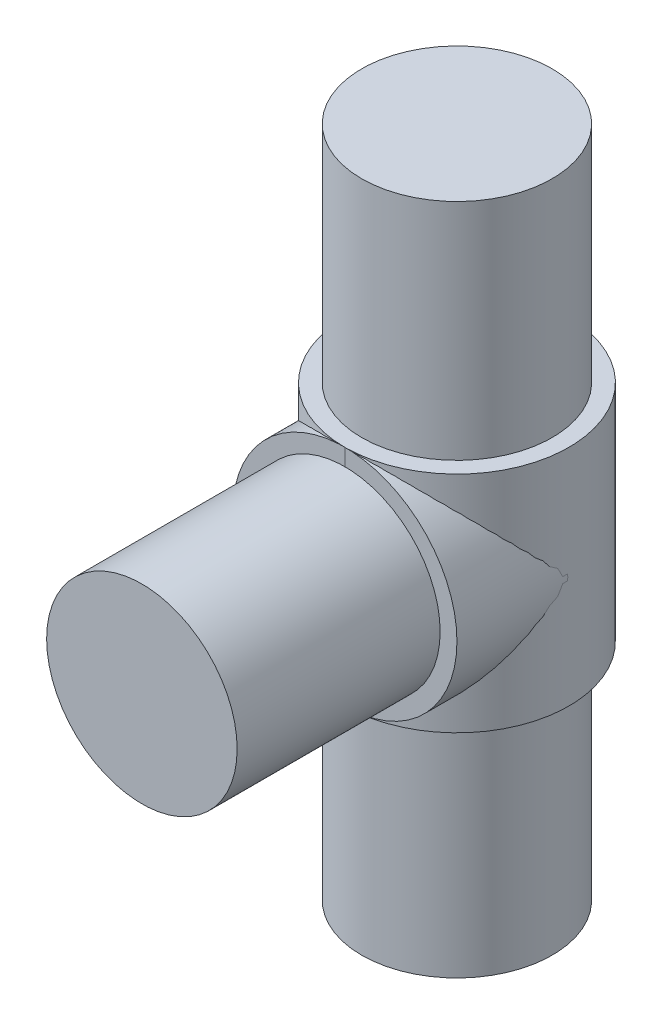
ISO-10303-21;
HEADER;
FILE_DESCRIPTION(('STEP AP214'),'2;1');
FILE_NAME('part.step','',(''),(''),'','','');
FILE_SCHEMA(('AUTOMOTIVE_DESIGN { 1 0 10303 214 1 1 1 1 }'));
ENDSEC;
DATA;
#1=APPLICATION_CONTEXT('core data for automotive mechanical design processes');
#2=APPLICATION_PROTOCOL_DEFINITION('international standard','automotive_design',2000,#1);
#3=PRODUCT_CONTEXT('',#1,'mechanical');
#4=PRODUCT('Part','Part','',(#3));
#5=PRODUCT_RELATED_PRODUCT_CATEGORY('part','',(#4));
#6=PRODUCT_DEFINITION_FORMATION('','',#4);
#7=PRODUCT_DEFINITION_CONTEXT('part definition',#1,'design');
#8=PRODUCT_DEFINITION('design','',#6,#7);
#9=PRODUCT_DEFINITION_SHAPE('','',#8);
#10=(LENGTH_UNIT() NAMED_UNIT(*) SI_UNIT(.MILLI.,.METRE.));
#11=(NAMED_UNIT(*) PLANE_ANGLE_UNIT() SI_UNIT($,.RADIAN.));
#12=(NAMED_UNIT(*) SI_UNIT($,.STERADIAN.) SOLID_ANGLE_UNIT());
#13=UNCERTAINTY_MEASURE_WITH_UNIT(LENGTH_MEASURE(1.E-05),#10,'distance_accuracy_value','');
#14=(GEOMETRIC_REPRESENTATION_CONTEXT(3) GLOBAL_UNCERTAINTY_ASSIGNED_CONTEXT((#13)) GLOBAL_UNIT_ASSIGNED_CONTEXT((#10,
#11,#12)) REPRESENTATION_CONTEXT('',''));
#15=CARTESIAN_POINT('',(0.,0.,0.));
#16=DIRECTION('',(0.,0.,1.));
#17=DIRECTION('',(1.,0.,0.));
#18=AXIS2_PLACEMENT_3D('',#15,#16,#17);
#19=CARTESIAN_POINT('',(-50.8892247979512,30.,-12.5));
#20=DIRECTION('',(0.,0.,1.));
#21=DIRECTION('',(1.,0.,0.));
#22=AXIS2_PLACEMENT_3D('',#19,#20,#21);
#23=CYLINDRICAL_SURFACE('',#22,10.);
#24=CARTESIAN_POINT('',(-50.8892247979512,30.,-12.5));
#25=DIRECTION('',(0.,0.,1.));
#26=DIRECTION('',(1.,0.,0.));
#27=AXIS2_PLACEMENT_3D('',#24,#25,#26);
#28=CIRCLE('',#27,10.);
#29=CARTESIAN_POINT('',(-40.8892247979512,30.,-12.5));
#30=VERTEX_POINT('',#29);
#31=EDGE_CURVE('E12',#30,#30,#28,.T.);
#32=ORIENTED_EDGE('',*,*,#31,.T.);
#33=EDGE_LOOP('',(#32));
#34=FACE_BOUND('',#33,.T.);
#35=CARTESIAN_POINT('',(-50.8892247979512,30.,-2.61159126360983));
#36=DIRECTION('',(0.,0.,1.));
#37=DIRECTION('',(1.,0.,0.));
#38=AXIS2_PLACEMENT_3D('',#35,#36,#37);
#39=CIRCLE('',#38,10.);
#40=CARTESIAN_POINT('',(-40.8892247979512,30.,-2.61159126360983));
#41=VERTEX_POINT('',#40);
#42=EDGE_CURVE('E51',#41,#41,#39,.T.);
#43=ORIENTED_EDGE('',*,*,#42,.F.);
#44=EDGE_LOOP('',(#43));
#45=FACE_BOUND('',#44,.T.);
#46=ADVANCED_FACE('F47',(#34,#45),#23,.T.);
#47=CARTESIAN_POINT('',(-50.8892247979512,30.,-12.5));
#48=DIRECTION('',(0.,0.,1.));
#49=DIRECTION('',(1.,0.,0.));
#50=AXIS2_PLACEMENT_3D('',#47,#48,#49);
#51=PLANE('',#50);
#52=ORIENTED_EDGE('',*,*,#31,.F.);
#53=EDGE_LOOP('',(#52));
#54=FACE_BOUND('',#53,.T.);
#55=ADVANCED_FACE('F62',(#54),#51,.F.);
#56=CARTESIAN_POINT('',(-50.8892247979512,30.,-2.61159126360983));
#57=DIRECTION('',(0.,0.,1.));
#58=DIRECTION('',(1.,0.,0.));
#59=AXIS2_PLACEMENT_3D('',#56,#57,#58);
#60=PLANE('',#59);
#61=ORIENTED_EDGE('',*,*,#42,.T.);
#62=EDGE_LOOP('',(#61));
#63=FACE_BOUND('',#62,.T.);
#64=ADVANCED_FACE('F49',(#63),#60,.T.);
#65=CLOSED_SHELL('',(#46,#55,#64));
#66=MANIFOLD_SOLID_BREP('B2',#65);
#67=CARTESIAN_POINT('',(-50.8892247979512,21.5,-12.609280988156));
#68=DIRECTION('',(0.,1.,0.));
#69=DIRECTION('',(0.,0.,1.));
#70=AXIS2_PLACEMENT_3D('',#67,#68,#69);
#71=CYLINDRICAL_SURFACE('',#70,10.);
#72=CARTESIAN_POINT('',(-50.8892247979512,20.0061356665333,-12.609280988156));
#73=DIRECTION('',(0.,1.,0.));
#74=DIRECTION('',(0.,0.,1.));
#75=AXIS2_PLACEMENT_3D('',#72,#73,#74);
#76=CIRCLE('',#75,10.);
#77=CARTESIAN_POINT('',(-50.8892247979512,20.0061356665333,-2.60928098815597));
#78=VERTEX_POINT('',#77);
#79=EDGE_CURVE('E46',#78,#78,#76,.T.);
#80=ORIENTED_EDGE('',*,*,#79,.T.);
#81=EDGE_LOOP('',(#80));
#82=FACE_BOUND('',#81,.T.);
#83=CARTESIAN_POINT('',(-50.8892247979512,39.9987591616122,-12.609280988156));
#84=DIRECTION('',(0.,1.,0.));
#85=DIRECTION('',(0.,0.,1.));
#86=AXIS2_PLACEMENT_3D('',#83,#84,#85);
#87=CIRCLE('',#86,10.);
#88=CARTESIAN_POINT('',(-50.8892247979512,39.9987591616122,-2.60928098815597));
#89=VERTEX_POINT('',#88);
#90=EDGE_CURVE('E103',#89,#89,#87,.T.);
#91=ORIENTED_EDGE('',*,*,#90,.F.);
#92=EDGE_LOOP('',(#91));
#93=FACE_BOUND('',#92,.T.);
#94=ADVANCED_FACE('F96',(#82,#93),#71,.T.);
#95=CARTESIAN_POINT('',(-50.8892247979512,20.0061356665333,-12.609280988156));
#96=DIRECTION('',(0.,1.,0.));
#97=DIRECTION('',(0.,0.,1.));
#98=AXIS2_PLACEMENT_3D('',#95,#96,#97);
#99=PLANE('',#98);
#100=ORIENTED_EDGE('',*,*,#79,.F.);
#101=EDGE_LOOP('',(#100));
#102=FACE_BOUND('',#101,.T.);
#103=ADVANCED_FACE('F98',(#102),#99,.F.);
#104=CARTESIAN_POINT('',(-50.8892247979512,39.9987591616122,-12.609280988156));
#105=DIRECTION('',(0.,1.,0.));
#106=DIRECTION('',(0.,0.,1.));
#107=AXIS2_PLACEMENT_3D('',#104,#105,#106);
#108=PLANE('',#107);
#109=ORIENTED_EDGE('',*,*,#90,.T.);
#110=EDGE_LOOP('',(#109));
#111=FACE_BOUND('',#110,.T.);
#112=ADVANCED_FACE('F109',(#111),#108,.T.);
#113=CLOSED_SHELL('',(#94,#103,#112));
#114=MANIFOLD_SOLID_BREP('B7',#113);
#115=CARTESIAN_POINT('',(-50.8892247979512,30.,-13.));
#116=DIRECTION('',(0.,0.,1.));
#117=DIRECTION('',(1.,0.,0.));
#118=AXIS2_PLACEMENT_3D('',#115,#116,#117);
#119=CYLINDRICAL_SURFACE('',#118,8.5);
#120=CARTESIAN_POINT('',(-50.8892247979512,30.,-13.));
#121=DIRECTION('',(0.,0.,1.));
#122=DIRECTION('',(1.,0.,0.));
#123=AXIS2_PLACEMENT_3D('',#120,#121,#122);
#124=CIRCLE('',#123,8.5);
#125=CARTESIAN_POINT('',(-42.3892247979512,30.,-13.));
#126=VERTEX_POINT('',#125);
#127=EDGE_CURVE('E95',#126,#126,#124,.T.);
#128=CARTESIAN_POINT('',(-50.8892247979512,30.,15.5));
#129=DIRECTION('',(0.,0.,1.));
#130=DIRECTION('',(1.,0.,0.));
#131=AXIS2_PLACEMENT_3D('',#128,#129,#130);
#132=CIRCLE('',#131,8.5);
#133=CARTESIAN_POINT('',(-42.3892247979512,30.,15.5));
#134=VERTEX_POINT('',#133);
#135=EDGE_CURVE('E150',#134,#134,#132,.T.);
#136=CARTESIAN_POINT('',(-42.3892247979512,30.,-13.));
#137=CARTESIAN_POINT('',(-42.3892247979512,30.,-12.703125));
#138=CARTESIAN_POINT('',(-42.3892247979512,30.,-12.40625));
#139=CARTESIAN_POINT('',(-42.3892247979512,30.,-11.8125));
#140=CARTESIAN_POINT('',(-42.3892247979512,30.,-11.515625));
#141=CARTESIAN_POINT('',(-42.3892247979512,30.,-10.921875));
#142=CARTESIAN_POINT('',(-42.3892247979512,30.,-10.625));
#143=CARTESIAN_POINT('',(-42.3892247979512,30.,-10.03125));
#144=CARTESIAN_POINT('',(-42.3892247979512,30.,-9.734375));
#145=CARTESIAN_POINT('',(-42.3892247979512,30.,-9.140625));
#146=CARTESIAN_POINT('',(-42.3892247979512,30.,-8.84375));
#147=CARTESIAN_POINT('',(-42.3892247979512,30.,-8.25));
#148=CARTESIAN_POINT('',(-42.3892247979512,30.,-7.953125));
#149=CARTESIAN_POINT('',(-42.3892247979512,30.,-7.359375));
#150=CARTESIAN_POINT('',(-42.3892247979512,30.,-7.0625));
#151=CARTESIAN_POINT('',(-42.3892247979512,30.,-6.46875));
#152=CARTESIAN_POINT('',(-42.3892247979512,30.,-6.171875));
#153=CARTESIAN_POINT('',(-42.3892247979512,30.,-5.578125));
#154=CARTESIAN_POINT('',(-42.3892247979512,30.,-5.28125));
#155=CARTESIAN_POINT('',(-42.3892247979512,30.,-4.6875));
#156=CARTESIAN_POINT('',(-42.3892247979512,30.,-4.390625));
#157=CARTESIAN_POINT('',(-42.3892247979512,30.,-3.796875));
#158=CARTESIAN_POINT('',(-42.3892247979512,30.,-3.5));
#159=CARTESIAN_POINT('',(-42.3892247979512,30.,-2.90625));
#160=CARTESIAN_POINT('',(-42.3892247979512,30.,-2.609375));
#161=CARTESIAN_POINT('',(-42.3892247979512,30.,-2.015625));
#162=CARTESIAN_POINT('',(-42.3892247979512,30.,-1.71875));
#163=CARTESIAN_POINT('',(-42.3892247979512,30.,-1.125));
#164=CARTESIAN_POINT('',(-42.3892247979512,30.,-0.828124999999999));
#165=CARTESIAN_POINT('',(-42.3892247979512,30.,-0.234374999999999));
#166=CARTESIAN_POINT('',(-42.3892247979512,30.,0.0625000000000007));
#167=CARTESIAN_POINT('',(-42.3892247979512,30.,0.656250000000001));
#168=CARTESIAN_POINT('',(-42.3892247979512,30.,0.953125000000001));
#169=CARTESIAN_POINT('',(-42.3892247979512,30.,1.546875));
#170=CARTESIAN_POINT('',(-42.3892247979512,30.,1.84375));
#171=CARTESIAN_POINT('',(-42.3892247979512,30.,2.4375));
#172=CARTESIAN_POINT('',(-42.3892247979512,30.,2.734375));
#173=CARTESIAN_POINT('',(-42.3892247979512,30.,3.328125));
#174=CARTESIAN_POINT('',(-42.3892247979512,30.,3.625));
#175=CARTESIAN_POINT('',(-42.3892247979512,30.,4.21875));
#176=CARTESIAN_POINT('',(-42.3892247979512,30.,4.515625));
#177=CARTESIAN_POINT('',(-42.3892247979512,30.,5.109375));
#178=CARTESIAN_POINT('',(-42.3892247979512,30.,5.40625));
#179=CARTESIAN_POINT('',(-42.3892247979512,30.,6.));
#180=CARTESIAN_POINT('',(-42.3892247979512,30.,6.296875));
#181=CARTESIAN_POINT('',(-42.3892247979512,30.,6.890625));
#182=CARTESIAN_POINT('',(-42.3892247979512,30.,7.1875));
#183=CARTESIAN_POINT('',(-42.3892247979512,30.,7.78125));
#184=CARTESIAN_POINT('',(-42.3892247979512,30.,8.078125));
#185=CARTESIAN_POINT('',(-42.3892247979512,30.,8.671875));
#186=CARTESIAN_POINT('',(-42.3892247979512,30.,8.96875));
#187=CARTESIAN_POINT('',(-42.3892247979512,30.,9.5625));
#188=CARTESIAN_POINT('',(-42.3892247979512,30.,9.859375));
#189=CARTESIAN_POINT('',(-42.3892247979512,30.,10.453125));
#190=CARTESIAN_POINT('',(-42.3892247979512,30.,10.75));
#191=CARTESIAN_POINT('',(-42.3892247979512,30.,11.34375));
#192=CARTESIAN_POINT('',(-42.3892247979512,30.,11.640625));
#193=CARTESIAN_POINT('',(-42.3892247979512,30.,12.234375));
#194=CARTESIAN_POINT('',(-42.3892247979512,30.,12.53125));
#195=CARTESIAN_POINT('',(-42.3892247979512,30.,13.125));
#196=CARTESIAN_POINT('',(-42.3892247979512,30.,13.421875));
#197=CARTESIAN_POINT('',(-42.3892247979512,30.,14.015625));
#198=CARTESIAN_POINT('',(-42.3892247979512,30.,14.3125));
#199=CARTESIAN_POINT('',(-42.3892247979512,30.,14.90625));
#200=CARTESIAN_POINT('',(-42.3892247979512,30.,15.203125));
#201=CARTESIAN_POINT('',(-42.3892247979512,30.,15.5));
#202=B_SPLINE_CURVE_WITH_KNOTS('',3,(#136,#137,#138,#139,#140,#141,#142,#143,#144,#145,#146,
#147,#148,#149,#150,#151,#152,#153,#154,#155,#156,#157,#158,#159,#160,#161,#162,#163,#164,#165,
#166,#167,#168,#169,#170,#171,#172,#173,#174,#175,#176,#177,#178,#179,#180,#181,#182,#183,#184,
#185,#186,#187,#188,#189,#190,#191,#192,#193,#194,#195,#196,#197,#198,#199,#200,#201),
.UNSPECIFIED.,.F.,.F.,(4,2,2,2,2,2,2,2,2,2,2,2,2,2,2,2,2,2,2,2,2,2,2,2,2,2,2,2,2,2,2,2,4),(0.,
0.890624999999999,1.78125,2.671875,3.5625,4.453125,5.34375,6.234375,7.125,8.015625,8.90625,
9.796875,10.6875,11.578125,12.46875,13.359375,14.25,15.140625,16.03125,16.921875,17.8125,
18.703125,19.59375,20.484375,21.375,22.265625,23.15625,24.046875,24.9375,25.828125,26.71875,
27.609375,28.5),.UNSPECIFIED.);
#203=EDGE_CURVE('BSEAM144',#126,#134,#202,.T.);
#204=ORIENTED_EDGE('',*,*,#127,.T.);
#205=ORIENTED_EDGE('',*,*,#135,.F.);
#206=ORIENTED_EDGE('',*,*,#203,.T.);
#207=ORIENTED_EDGE('',*,*,#203,.F.);
#208=EDGE_LOOP('',(#204,#206,#205,#207));
#209=FACE_BOUND('',#208,.T.);
#210=ADVANCED_FACE('F144',(#209),#119,.T.);
#211=CARTESIAN_POINT('',(-50.8892247979512,30.,-13.));
#212=DIRECTION('',(0.,0.,1.));
#213=DIRECTION('',(1.,0.,0.));
#214=AXIS2_PLACEMENT_3D('',#211,#212,#213);
#215=PLANE('',#214);
#216=ORIENTED_EDGE('',*,*,#127,.F.);
#217=EDGE_LOOP('',(#216));
#218=FACE_BOUND('',#217,.T.);
#219=ADVANCED_FACE('F159',(#218),#215,.F.);
#220=CARTESIAN_POINT('',(-50.8892247979512,30.,15.5));
#221=DIRECTION('',(0.,0.,1.));
#222=DIRECTION('',(1.,0.,0.));
#223=AXIS2_PLACEMENT_3D('',#220,#221,#222);
#224=PLANE('',#223);
#225=ORIENTED_EDGE('',*,*,#135,.T.);
#226=EDGE_LOOP('',(#225));
#227=FACE_BOUND('',#226,.T.);
#228=ADVANCED_FACE('F156',(#227),#224,.T.);
#229=CLOSED_SHELL('',(#210,#219,#228));
#230=MANIFOLD_SOLID_BREP('B41',#229);
#231=CARTESIAN_POINT('',(-50.8892247979512,60.,-12.609280988156));
#232=DIRECTION('',(0.,-1.,0.));
#233=DIRECTION('',(0.,0.,-1.));
#234=AXIS2_PLACEMENT_3D('',#231,#232,#233);
#235=CYLINDRICAL_SURFACE('',#234,8.5);
#236=CARTESIAN_POINT('',(-50.8892247979512,60.,-12.609280988156));
#237=DIRECTION('',(0.,1.,0.));
#238=DIRECTION('',(0.,0.,1.));
#239=AXIS2_PLACEMENT_3D('',#236,#237,#238);
#240=CIRCLE('',#239,8.5);
#241=CARTESIAN_POINT('',(-50.8892247979512,60.,-4.10928098815598));
#242=VERTEX_POINT('',#241);
#243=EDGE_CURVE('E143',#242,#242,#240,.T.);
#244=ORIENTED_EDGE('',*,*,#243,.F.);
#245=EDGE_LOOP('',(#244));
#246=FACE_BOUND('',#245,.T.);
#247=CARTESIAN_POINT('',(-50.8892247979512,0.,-12.609280988156));
#248=DIRECTION('',(0.,1.,0.));
#249=DIRECTION('',(0.,0.,1.));
#250=AXIS2_PLACEMENT_3D('',#247,#248,#249);
#251=CIRCLE('',#250,8.5);
#252=CARTESIAN_POINT('',(-50.8892247979512,0.,-4.10928098815598));
#253=VERTEX_POINT('',#252);
#254=EDGE_CURVE('E188',#253,#253,#251,.T.);
#255=ORIENTED_EDGE('',*,*,#254,.T.);
#256=EDGE_LOOP('',(#255));
#257=FACE_BOUND('',#256,.T.);
#258=ADVANCED_FACE('F185',(#246,#257),#235,.T.);
#259=CARTESIAN_POINT('',(-50.8892247979512,60.,-12.609280988156));
#260=DIRECTION('',(0.,1.,0.));
#261=DIRECTION('',(0.,0.,1.));
#262=AXIS2_PLACEMENT_3D('',#259,#260,#261);
#263=PLANE('',#262);
#264=ORIENTED_EDGE('',*,*,#243,.T.);
#265=EDGE_LOOP('',(#264));
#266=FACE_BOUND('',#265,.T.);
#267=ADVANCED_FACE('F200',(#266),#263,.T.);
#268=CARTESIAN_POINT('',(-50.8892247979512,0.,-12.609280988156));
#269=DIRECTION('',(0.,1.,0.));
#270=DIRECTION('',(0.,0.,1.));
#271=AXIS2_PLACEMENT_3D('',#268,#269,#270);
#272=PLANE('',#271);
#273=ORIENTED_EDGE('',*,*,#254,.F.);
#274=EDGE_LOOP('',(#273));
#275=FACE_BOUND('',#274,.T.);
#276=ADVANCED_FACE('F198',(#275),#272,.F.);
#277=CLOSED_SHELL('',(#258,#267,#276));
#278=MANIFOLD_SOLID_BREP('B90',#277);
#279=ADVANCED_BREP_SHAPE_REPRESENTATION('',(#18,#66,#114,#230,#278),#14);
#280=SHAPE_DEFINITION_REPRESENTATION(#9,#279);
ENDSEC;
END-ISO-10303-21;
